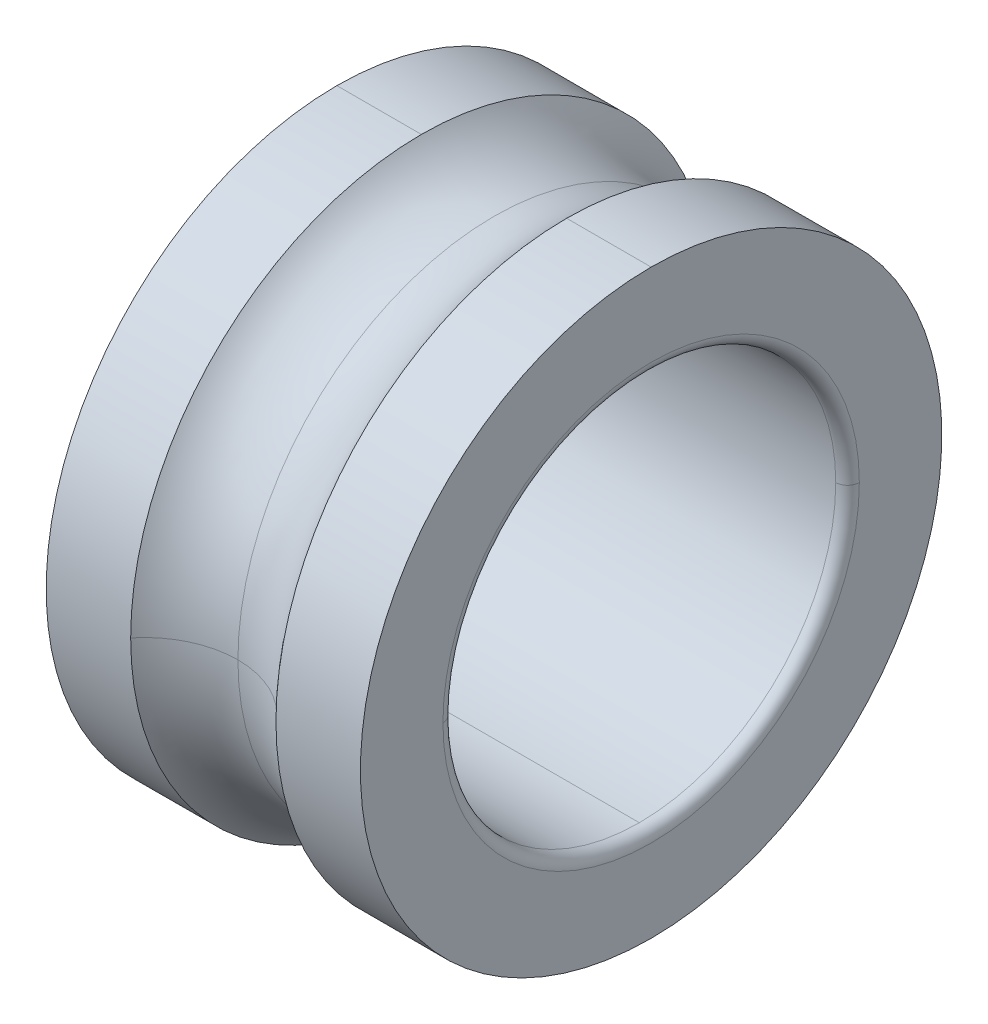
ISO-10303-21;
HEADER;
FILE_DESCRIPTION(('STEP AP214'),'2;1');
FILE_NAME('part.step','',(''),(''),'','','');
FILE_SCHEMA(('AUTOMOTIVE_DESIGN { 1 0 10303 214 1 1 1 1 }'));
ENDSEC;
DATA;
#1=APPLICATION_CONTEXT('core data for automotive mechanical design processes');
#2=APPLICATION_PROTOCOL_DEFINITION('international standard','automotive_design',2000,#1);
#3=PRODUCT_CONTEXT('',#1,'mechanical');
#4=PRODUCT('Part','Part','',(#3));
#5=PRODUCT_RELATED_PRODUCT_CATEGORY('part','',(#4));
#6=PRODUCT_DEFINITION_FORMATION('','',#4);
#7=PRODUCT_DEFINITION_CONTEXT('part definition',#1,'design');
#8=PRODUCT_DEFINITION('design','',#6,#7);
#9=PRODUCT_DEFINITION_SHAPE('','',#8);
#10=(LENGTH_UNIT() NAMED_UNIT(*) SI_UNIT(.MILLI.,.METRE.));
#11=(NAMED_UNIT(*) PLANE_ANGLE_UNIT() SI_UNIT($,.RADIAN.));
#12=(NAMED_UNIT(*) SI_UNIT($,.STERADIAN.) SOLID_ANGLE_UNIT());
#13=UNCERTAINTY_MEASURE_WITH_UNIT(LENGTH_MEASURE(1.E-05),#10,'distance_accuracy_value','');
#14=(GEOMETRIC_REPRESENTATION_CONTEXT(3) GLOBAL_UNCERTAINTY_ASSIGNED_CONTEXT((#13)) GLOBAL_UNIT_ASSIGNED_CONTEXT((#10,
#11,#12)) REPRESENTATION_CONTEXT('',''));
#15=CARTESIAN_POINT('',(0.,0.,0.));
#16=DIRECTION('',(0.,0.,1.));
#17=DIRECTION('',(1.,0.,0.));
#18=AXIS2_PLACEMENT_3D('',#15,#16,#17);
#19=CARTESIAN_POINT('',(6.92454867367814,0.,0.));
#20=DIRECTION('',(1.,0.,0.));
#21=DIRECTION('',(0.,1.,0.));
#22=AXIS2_PLACEMENT_3D('',#19,#20,#21);
#23=CYLINDRICAL_SURFACE('',#22,7.4);
#24=DIRECTION('',(1.,0.,0.));
#25=VECTOR('',#24,1.);
#26=CARTESIAN_POINT('',(6.92454867367814,7.4,0.));
#27=LINE('',#26,#25);
#28=CARTESIAN_POINT('',(5.84909734735627,7.4,0.));
#29=VERTEX_POINT('',#28);
#30=CARTESIAN_POINT('',(8.,7.4,0.));
#31=VERTEX_POINT('',#30);
#32=EDGE_CURVE('E138',#29,#31,#27,.T.);
#33=ORIENTED_EDGE('',*,*,#32,.T.);
#34=CARTESIAN_POINT('',(8.,0.,0.));
#35=DIRECTION('',(1.,0.,0.));
#36=DIRECTION('',(0.,1.,0.));
#37=AXIS2_PLACEMENT_3D('',#34,#35,#36);
#38=CIRCLE('',#37,7.4);
#39=CARTESIAN_POINT('',(8.,-7.4,0.));
#40=VERTEX_POINT('',#39);
#41=EDGE_CURVE('E185',#40,#31,#38,.T.);
#42=ORIENTED_EDGE('',*,*,#41,.F.);
#43=DIRECTION('',(-1.,0.,0.));
#44=VECTOR('',#43,1.);
#45=CARTESIAN_POINT('',(6.92454867367814,-7.4,0.));
#46=LINE('',#45,#44);
#47=CARTESIAN_POINT('',(5.84909734735627,-7.4,0.));
#48=VERTEX_POINT('',#47);
#49=EDGE_CURVE('E141',#40,#48,#46,.T.);
#50=ORIENTED_EDGE('',*,*,#49,.T.);
#51=CARTESIAN_POINT('',(5.84909734735627,0.,0.));
#52=DIRECTION('',(1.,0.,0.));
#53=DIRECTION('',(0.,1.,0.));
#54=AXIS2_PLACEMENT_3D('',#51,#52,#53);
#55=CIRCLE('',#54,7.4);
#56=CARTESIAN_POINT('',(5.84909734735627,0.,-7.4));
#57=VERTEX_POINT('',#56);
#58=EDGE_CURVE('E133',#48,#57,#55,.T.);
#59=ORIENTED_EDGE('',*,*,#58,.T.);
#60=CARTESIAN_POINT('',(5.84909734735627,0.,0.));
#61=DIRECTION('',(1.,0.,0.));
#62=DIRECTION('',(0.,1.,0.));
#63=AXIS2_PLACEMENT_3D('',#60,#61,#62);
#64=CIRCLE('',#63,7.4);
#65=EDGE_CURVE('E207',#57,#29,#64,.T.);
#66=ORIENTED_EDGE('',*,*,#65,.T.);
#67=EDGE_LOOP('',(#33,#42,#50,#59,#66));
#68=FACE_BOUND('',#67,.T.);
#69=ADVANCED_FACE('F16',(#68),#23,.T.);
#70=CARTESIAN_POINT('',(4.,0.,0.));
#71=DIRECTION('',(1.,0.,0.));
#72=DIRECTION('',(0.,0.,-1.));
#73=AXIS2_PLACEMENT_3D('',#70,#71,#72);
#74=TOROIDAL_SURFACE('',#73,8.9,2.381);
#75=CARTESIAN_POINT('',(4.,0.,0.));
#76=DIRECTION('',(-1.,0.,0.));
#77=DIRECTION('',(0.,0.,1.));
#78=AXIS2_PLACEMENT_3D('',#75,#76,#77);
#79=CIRCLE('',#78,6.519);
#80=CARTESIAN_POINT('',(4.,0.,6.519));
#81=VERTEX_POINT('',#80);
#82=CARTESIAN_POINT('',(4.,0.,-6.519));
#83=VERTEX_POINT('',#82);
#84=EDGE_CURVE('E223',#81,#83,#79,.T.);
#85=ORIENTED_EDGE('',*,*,#84,.T.);
#86=CARTESIAN_POINT('',(4.,0.,-8.9));
#87=DIRECTION('',(0.,-1.,0.));
#88=DIRECTION('',(0.,0.,-1.));
#89=AXIS2_PLACEMENT_3D('',#86,#87,#88);
#90=CIRCLE('',#89,2.381);
#91=CARTESIAN_POINT('',(2.15090265264373,0.,-7.4));
#92=VERTEX_POINT('',#91);
#93=EDGE_CURVE('E152',#83,#92,#90,.T.);
#94=ORIENTED_EDGE('',*,*,#93,.T.);
#95=CARTESIAN_POINT('',(2.15090265264373,0.,0.));
#96=DIRECTION('',(1.,0.,0.));
#97=DIRECTION('',(0.,1.,0.));
#98=AXIS2_PLACEMENT_3D('',#95,#96,#97);
#99=CIRCLE('',#98,7.4);
#100=CARTESIAN_POINT('',(2.15090265264373,7.4,0.));
#101=VERTEX_POINT('',#100);
#102=EDGE_CURVE('E11',#92,#101,#99,.T.);
#103=ORIENTED_EDGE('',*,*,#102,.T.);
#104=CARTESIAN_POINT('',(2.15090265264373,0.,0.));
#105=DIRECTION('',(1.,0.,0.));
#106=DIRECTION('',(0.,1.,0.));
#107=AXIS2_PLACEMENT_3D('',#104,#105,#106);
#108=CIRCLE('',#107,7.4);
#109=CARTESIAN_POINT('',(2.15090265264373,0.,7.4));
#110=VERTEX_POINT('',#109);
#111=EDGE_CURVE('E162',#101,#110,#108,.T.);
#112=ORIENTED_EDGE('',*,*,#111,.T.);
#113=CARTESIAN_POINT('',(4.,0.,8.9));
#114=DIRECTION('',(0.,-1.,0.));
#115=DIRECTION('',(0.,0.,1.));
#116=AXIS2_PLACEMENT_3D('',#113,#114,#115);
#117=CIRCLE('',#116,2.381);
#118=EDGE_CURVE('E146',#110,#81,#117,.T.);
#119=ORIENTED_EDGE('',*,*,#118,.T.);
#120=EDGE_LOOP('',(#85,#94,#103,#112,#119));
#121=FACE_BOUND('',#120,.T.);
#122=ADVANCED_FACE('F229',(#121),#74,.F.);
#123=CARTESIAN_POINT('',(1.07545132632186,0.,0.));
#124=DIRECTION('',(1.,0.,0.));
#125=DIRECTION('',(0.,1.,0.));
#126=AXIS2_PLACEMENT_3D('',#123,#124,#125);
#127=CYLINDRICAL_SURFACE('',#126,7.4);
#128=DIRECTION('',(1.,0.,0.));
#129=VECTOR('',#128,1.);
#130=CARTESIAN_POINT('',(1.07545132632186,7.4,0.));
#131=LINE('',#130,#129);
#132=CARTESIAN_POINT('',(0.,7.4,0.));
#133=VERTEX_POINT('',#132);
#134=EDGE_CURVE('E155',#133,#101,#131,.T.);
#135=ORIENTED_EDGE('',*,*,#134,.T.);
#136=ORIENTED_EDGE('',*,*,#102,.F.);
#137=CARTESIAN_POINT('',(2.15090265264373,0.,0.));
#138=DIRECTION('',(1.,0.,0.));
#139=DIRECTION('',(0.,1.,0.));
#140=AXIS2_PLACEMENT_3D('',#137,#138,#139);
#141=CIRCLE('',#140,7.4);
#142=CARTESIAN_POINT('',(2.15090265264373,-7.4,0.));
#143=VERTEX_POINT('',#142);
#144=EDGE_CURVE('E149',#143,#92,#141,.T.);
#145=ORIENTED_EDGE('',*,*,#144,.F.);
#146=DIRECTION('',(-1.,0.,0.));
#147=VECTOR('',#146,1.);
#148=CARTESIAN_POINT('',(1.07545132632186,-7.4,0.));
#149=LINE('',#148,#147);
#150=CARTESIAN_POINT('',(0.,-7.4,0.));
#151=VERTEX_POINT('',#150);
#152=EDGE_CURVE('E159',#143,#151,#149,.T.);
#153=ORIENTED_EDGE('',*,*,#152,.T.);
#154=CARTESIAN_POINT('',(0.,0.,0.));
#155=DIRECTION('',(1.,0.,0.));
#156=DIRECTION('',(0.,1.,0.));
#157=AXIS2_PLACEMENT_3D('',#154,#155,#156);
#158=CIRCLE('',#157,7.4);
#159=EDGE_CURVE('E24',#151,#133,#158,.T.);
#160=ORIENTED_EDGE('',*,*,#159,.T.);
#161=EDGE_LOOP('',(#135,#136,#145,#153,#160));
#162=FACE_BOUND('',#161,.T.);
#163=ADVANCED_FACE('F196',(#162),#127,.T.);
#164=CARTESIAN_POINT('',(0.,6.35,0.));
#165=DIRECTION('',(-1.,0.,0.));
#166=DIRECTION('',(0.,0.,1.));
#167=AXIS2_PLACEMENT_3D('',#164,#165,#166);
#168=PLANE('',#167);
#169=CARTESIAN_POINT('',(0.,0.,0.));
#170=DIRECTION('',(1.,0.,0.));
#171=DIRECTION('',(0.,1.,0.));
#172=AXIS2_PLACEMENT_3D('',#169,#170,#171);
#173=CIRCLE('',#172,5.3);
#174=CARTESIAN_POINT('',(0.,0.,5.3));
#175=VERTEX_POINT('',#174);
#176=CARTESIAN_POINT('',(0.,0.,-5.3));
#177=VERTEX_POINT('',#176);
#178=EDGE_CURVE('E190',#175,#177,#173,.T.);
#179=ORIENTED_EDGE('',*,*,#178,.T.);
#180=CARTESIAN_POINT('',(0.,0.,0.));
#181=DIRECTION('',(1.,0.,0.));
#182=DIRECTION('',(0.,1.,0.));
#183=AXIS2_PLACEMENT_3D('',#180,#181,#182);
#184=CIRCLE('',#183,5.3);
#185=EDGE_CURVE('E176',#177,#175,#184,.T.);
#186=ORIENTED_EDGE('',*,*,#185,.T.);
#187=EDGE_LOOP('',(#179,#186));
#188=FACE_BOUND('',#187,.T.);
#189=CARTESIAN_POINT('',(0.,0.,0.));
#190=DIRECTION('',(1.,0.,0.));
#191=DIRECTION('',(0.,1.,0.));
#192=AXIS2_PLACEMENT_3D('',#189,#190,#191);
#193=CIRCLE('',#192,7.4);
#194=EDGE_CURVE('E156',#133,#151,#193,.T.);
#195=ORIENTED_EDGE('',*,*,#194,.F.);
#196=ORIENTED_EDGE('',*,*,#159,.F.);
#197=EDGE_LOOP('',(#195,#196));
#198=FACE_BOUND('',#197,.T.);
#199=ADVANCED_FACE('F18',(#188,#198),#168,.T.);
#200=CARTESIAN_POINT('',(0.3,0.,0.));
#201=DIRECTION('',(1.,0.,0.));
#202=DIRECTION('',(0.,0.,-1.));
#203=AXIS2_PLACEMENT_3D('',#200,#201,#202);
#204=TOROIDAL_SURFACE('',#203,5.3,0.3);
#205=CARTESIAN_POINT('',(0.3,0.,-5.3));
#206=DIRECTION('',(0.,-1.,0.));
#207=DIRECTION('',(0.,0.,-1.));
#208=AXIS2_PLACEMENT_3D('',#205,#206,#207);
#209=CIRCLE('',#208,0.3);
#210=CARTESIAN_POINT('',(0.3,0.,-5.));
#211=VERTEX_POINT('',#210);
#212=EDGE_CURVE('E164',#211,#177,#209,.T.);
#213=ORIENTED_EDGE('',*,*,#212,.T.);
#214=ORIENTED_EDGE('',*,*,#178,.F.);
#215=CARTESIAN_POINT('',(0.3,0.,5.3));
#216=DIRECTION('',(0.,-1.,0.));
#217=DIRECTION('',(0.,0.,1.));
#218=AXIS2_PLACEMENT_3D('',#215,#216,#217);
#219=CIRCLE('',#218,0.3);
#220=CARTESIAN_POINT('',(0.3,0.,5.));
#221=VERTEX_POINT('',#220);
#222=EDGE_CURVE('E173',#175,#221,#219,.T.);
#223=ORIENTED_EDGE('',*,*,#222,.T.);
#224=CARTESIAN_POINT('',(0.3,0.,0.));
#225=DIRECTION('',(1.,0.,0.));
#226=DIRECTION('',(0.,1.,0.));
#227=AXIS2_PLACEMENT_3D('',#224,#225,#226);
#228=CIRCLE('',#227,5.);
#229=CARTESIAN_POINT('',(0.3,-5.,0.));
#230=VERTEX_POINT('',#229);
#231=EDGE_CURVE('E188',#221,#230,#228,.T.);
#232=ORIENTED_EDGE('',*,*,#231,.T.);
#233=CARTESIAN_POINT('',(0.3,0.,0.));
#234=DIRECTION('',(1.,0.,0.));
#235=DIRECTION('',(0.,1.,0.));
#236=AXIS2_PLACEMENT_3D('',#233,#234,#235);
#237=CIRCLE('',#236,5.);
#238=EDGE_CURVE('E124',#230,#211,#237,.T.);
#239=ORIENTED_EDGE('',*,*,#238,.T.);
#240=EDGE_LOOP('',(#213,#214,#223,#232,#239));
#241=FACE_BOUND('',#240,.T.);
#242=ADVANCED_FACE('F271',(#241),#204,.T.);
#243=CARTESIAN_POINT('',(4.,0.,0.));
#244=DIRECTION('',(1.,0.,0.));
#245=DIRECTION('',(0.,1.,0.));
#246=AXIS2_PLACEMENT_3D('',#243,#244,#245);
#247=CYLINDRICAL_SURFACE('',#246,5.);
#248=DIRECTION('',(1.,0.,0.));
#249=VECTOR('',#248,1.);
#250=CARTESIAN_POINT('',(4.,5.,0.));
#251=LINE('',#250,#249);
#252=CARTESIAN_POINT('',(0.3,5.,0.));
#253=VERTEX_POINT('',#252);
#254=CARTESIAN_POINT('',(7.7,5.,0.));
#255=VERTEX_POINT('',#254);
#256=EDGE_CURVE('E179',#253,#255,#251,.T.);
#257=ORIENTED_EDGE('',*,*,#256,.T.);
#258=CARTESIAN_POINT('',(7.7,0.,0.));
#259=DIRECTION('',(1.,0.,0.));
#260=DIRECTION('',(0.,1.,0.));
#261=AXIS2_PLACEMENT_3D('',#258,#259,#260);
#262=CIRCLE('',#261,5.);
#263=CARTESIAN_POINT('',(7.7,0.,5.));
#264=VERTEX_POINT('',#263);
#265=EDGE_CURVE('E115',#255,#264,#262,.T.);
#266=ORIENTED_EDGE('',*,*,#265,.T.);
#267=CARTESIAN_POINT('',(7.7,0.,0.));
#268=DIRECTION('',(1.,0.,0.));
#269=DIRECTION('',(0.,1.,0.));
#270=AXIS2_PLACEMENT_3D('',#267,#268,#269);
#271=CIRCLE('',#270,5.);
#272=CARTESIAN_POINT('',(7.7,-5.,0.));
#273=VERTEX_POINT('',#272);
#274=EDGE_CURVE('E31',#264,#273,#271,.T.);
#275=ORIENTED_EDGE('',*,*,#274,.T.);
#276=DIRECTION('',(-1.,0.,0.));
#277=VECTOR('',#276,1.);
#278=CARTESIAN_POINT('',(4.,-5.,0.));
#279=LINE('',#278,#277);
#280=EDGE_CURVE('E122',#273,#230,#279,.T.);
#281=ORIENTED_EDGE('',*,*,#280,.T.);
#282=ORIENTED_EDGE('',*,*,#231,.F.);
#283=CARTESIAN_POINT('',(0.3,0.,0.));
#284=DIRECTION('',(1.,0.,0.));
#285=DIRECTION('',(0.,1.,0.));
#286=AXIS2_PLACEMENT_3D('',#283,#284,#285);
#287=CIRCLE('',#286,5.);
#288=EDGE_CURVE('E170',#253,#221,#287,.T.);
#289=ORIENTED_EDGE('',*,*,#288,.F.);
#290=EDGE_LOOP('',(#257,#266,#275,#281,#282,#289));
#291=FACE_BOUND('',#290,.T.);
#292=ADVANCED_FACE('F254',(#291),#247,.F.);
#293=CARTESIAN_POINT('',(7.7,0.,0.));
#294=DIRECTION('',(1.,0.,0.));
#295=DIRECTION('',(0.,0.,-1.));
#296=AXIS2_PLACEMENT_3D('',#293,#294,#295);
#297=TOROIDAL_SURFACE('',#296,5.3,0.3);
#298=CARTESIAN_POINT('',(7.7,0.,-5.3));
#299=DIRECTION('',(0.,-1.,0.));
#300=DIRECTION('',(0.,0.,-1.));
#301=AXIS2_PLACEMENT_3D('',#298,#299,#300);
#302=CIRCLE('',#301,0.3);
#303=CARTESIAN_POINT('',(8.,0.,-5.3));
#304=VERTEX_POINT('',#303);
#305=CARTESIAN_POINT('',(7.7,0.,-5.));
#306=VERTEX_POINT('',#305);
#307=EDGE_CURVE('E101',#304,#306,#302,.T.);
#308=ORIENTED_EDGE('',*,*,#307,.T.);
#309=CARTESIAN_POINT('',(7.7,0.,0.));
#310=DIRECTION('',(1.,0.,0.));
#311=DIRECTION('',(0.,1.,0.));
#312=AXIS2_PLACEMENT_3D('',#309,#310,#311);
#313=CIRCLE('',#312,5.);
#314=EDGE_CURVE('E105',#273,#306,#313,.T.);
#315=ORIENTED_EDGE('',*,*,#314,.F.);
#316=ORIENTED_EDGE('',*,*,#274,.F.);
#317=CARTESIAN_POINT('',(7.7,0.,5.3));
#318=DIRECTION('',(0.,-1.,0.));
#319=DIRECTION('',(0.,0.,1.));
#320=AXIS2_PLACEMENT_3D('',#317,#318,#319);
#321=CIRCLE('',#320,0.3);
#322=CARTESIAN_POINT('',(8.,0.,5.3));
#323=VERTEX_POINT('',#322);
#324=EDGE_CURVE('E182',#264,#323,#321,.T.);
#325=ORIENTED_EDGE('',*,*,#324,.T.);
#326=CARTESIAN_POINT('',(8.,0.,0.));
#327=DIRECTION('',(1.,0.,0.));
#328=DIRECTION('',(0.,1.,0.));
#329=AXIS2_PLACEMENT_3D('',#326,#327,#328);
#330=CIRCLE('',#329,5.3);
#331=EDGE_CURVE('E39',#323,#304,#330,.T.);
#332=ORIENTED_EDGE('',*,*,#331,.T.);
#333=EDGE_LOOP('',(#308,#315,#316,#325,#332));
#334=FACE_BOUND('',#333,.T.);
#335=ADVANCED_FACE('F103',(#334),#297,.T.);
#336=CARTESIAN_POINT('',(8.,6.35,0.));
#337=DIRECTION('',(1.,0.,0.));
#338=DIRECTION('',(0.,1.,0.));
#339=AXIS2_PLACEMENT_3D('',#336,#337,#338);
#340=PLANE('',#339);
#341=CARTESIAN_POINT('',(8.,0.,0.));
#342=DIRECTION('',(1.,0.,0.));
#343=DIRECTION('',(0.,1.,0.));
#344=AXIS2_PLACEMENT_3D('',#341,#342,#343);
#345=CIRCLE('',#344,5.3);
#346=EDGE_CURVE('E109',#304,#323,#345,.T.);
#347=ORIENTED_EDGE('',*,*,#346,.F.);
#348=ORIENTED_EDGE('',*,*,#331,.F.);
#349=EDGE_LOOP('',(#347,#348));
#350=FACE_BOUND('',#349,.T.);
#351=CARTESIAN_POINT('',(8.,0.,0.));
#352=DIRECTION('',(1.,0.,0.));
#353=DIRECTION('',(0.,1.,0.));
#354=AXIS2_PLACEMENT_3D('',#351,#352,#353);
#355=CIRCLE('',#354,7.4);
#356=EDGE_CURVE('E143',#31,#40,#355,.T.);
#357=ORIENTED_EDGE('',*,*,#356,.T.);
#358=ORIENTED_EDGE('',*,*,#41,.T.);
#359=EDGE_LOOP('',(#357,#358));
#360=FACE_BOUND('',#359,.T.);
#361=ADVANCED_FACE('F245',(#350,#360),#340,.T.);
#362=CARTESIAN_POINT('',(7.7,0.,0.));
#363=DIRECTION('',(1.,0.,0.));
#364=DIRECTION('',(0.,0.,-1.));
#365=AXIS2_PLACEMENT_3D('',#362,#363,#364);
#366=TOROIDAL_SURFACE('',#365,5.3,0.3);
#367=ORIENTED_EDGE('',*,*,#307,.F.);
#368=ORIENTED_EDGE('',*,*,#346,.T.);
#369=ORIENTED_EDGE('',*,*,#324,.F.);
#370=ORIENTED_EDGE('',*,*,#265,.F.);
#371=CARTESIAN_POINT('',(7.7,0.,0.));
#372=DIRECTION('',(1.,0.,0.));
#373=DIRECTION('',(0.,1.,0.));
#374=AXIS2_PLACEMENT_3D('',#371,#372,#373);
#375=CIRCLE('',#374,5.);
#376=EDGE_CURVE('E110',#306,#255,#375,.T.);
#377=ORIENTED_EDGE('',*,*,#376,.F.);
#378=EDGE_LOOP('',(#367,#368,#369,#370,#377));
#379=FACE_BOUND('',#378,.T.);
#380=ADVANCED_FACE('F113',(#379),#366,.T.);
#381=CARTESIAN_POINT('',(4.,0.,0.));
#382=DIRECTION('',(1.,0.,0.));
#383=DIRECTION('',(0.,1.,0.));
#384=AXIS2_PLACEMENT_3D('',#381,#382,#383);
#385=CYLINDRICAL_SURFACE('',#384,5.);
#386=ORIENTED_EDGE('',*,*,#256,.F.);
#387=CARTESIAN_POINT('',(0.3,0.,0.));
#388=DIRECTION('',(1.,0.,0.));
#389=DIRECTION('',(0.,1.,0.));
#390=AXIS2_PLACEMENT_3D('',#387,#388,#389);
#391=CIRCLE('',#390,5.);
#392=EDGE_CURVE('E167',#211,#253,#391,.T.);
#393=ORIENTED_EDGE('',*,*,#392,.F.);
#394=ORIENTED_EDGE('',*,*,#238,.F.);
#395=ORIENTED_EDGE('',*,*,#280,.F.);
#396=ORIENTED_EDGE('',*,*,#314,.T.);
#397=ORIENTED_EDGE('',*,*,#376,.T.);
#398=EDGE_LOOP('',(#386,#393,#394,#395,#396,#397));
#399=FACE_BOUND('',#398,.T.);
#400=ADVANCED_FACE('F119',(#399),#385,.F.);
#401=CARTESIAN_POINT('',(0.3,0.,0.));
#402=DIRECTION('',(1.,0.,0.));
#403=DIRECTION('',(0.,0.,-1.));
#404=AXIS2_PLACEMENT_3D('',#401,#402,#403);
#405=TOROIDAL_SURFACE('',#404,5.3,0.3);
#406=ORIENTED_EDGE('',*,*,#212,.F.);
#407=ORIENTED_EDGE('',*,*,#392,.T.);
#408=ORIENTED_EDGE('',*,*,#288,.T.);
#409=ORIENTED_EDGE('',*,*,#222,.F.);
#410=ORIENTED_EDGE('',*,*,#185,.F.);
#411=EDGE_LOOP('',(#406,#407,#408,#409,#410));
#412=FACE_BOUND('',#411,.T.);
#413=ADVANCED_FACE('F277',(#412),#405,.T.);
#414=CARTESIAN_POINT('',(1.07545132632186,0.,0.));
#415=DIRECTION('',(1.,0.,0.));
#416=DIRECTION('',(0.,1.,0.));
#417=AXIS2_PLACEMENT_3D('',#414,#415,#416);
#418=CYLINDRICAL_SURFACE('',#417,7.4);
#419=ORIENTED_EDGE('',*,*,#134,.F.);
#420=ORIENTED_EDGE('',*,*,#194,.T.);
#421=ORIENTED_EDGE('',*,*,#152,.F.);
#422=CARTESIAN_POINT('',(2.15090265264373,0.,0.));
#423=DIRECTION('',(1.,0.,0.));
#424=DIRECTION('',(0.,1.,0.));
#425=AXIS2_PLACEMENT_3D('',#422,#423,#424);
#426=CIRCLE('',#425,7.4);
#427=EDGE_CURVE('E128',#110,#143,#426,.T.);
#428=ORIENTED_EDGE('',*,*,#427,.F.);
#429=ORIENTED_EDGE('',*,*,#111,.F.);
#430=EDGE_LOOP('',(#419,#420,#421,#428,#429));
#431=FACE_BOUND('',#430,.T.);
#432=ADVANCED_FACE('F202',(#431),#418,.T.);
#433=CARTESIAN_POINT('',(4.,0.,0.));
#434=DIRECTION('',(1.,0.,0.));
#435=DIRECTION('',(0.,0.,-1.));
#436=AXIS2_PLACEMENT_3D('',#433,#434,#435);
#437=TOROIDAL_SURFACE('',#436,8.9,2.381);
#438=CARTESIAN_POINT('',(4.,0.,0.));
#439=DIRECTION('',(-1.,0.,0.));
#440=DIRECTION('',(0.,0.,1.));
#441=AXIS2_PLACEMENT_3D('',#438,#439,#440);
#442=CIRCLE('',#441,6.519);
#443=EDGE_CURVE('E130',#83,#81,#442,.T.);
#444=ORIENTED_EDGE('',*,*,#443,.T.);
#445=ORIENTED_EDGE('',*,*,#118,.F.);
#446=ORIENTED_EDGE('',*,*,#427,.T.);
#447=ORIENTED_EDGE('',*,*,#144,.T.);
#448=ORIENTED_EDGE('',*,*,#93,.F.);
#449=EDGE_LOOP('',(#444,#445,#446,#447,#448));
#450=FACE_BOUND('',#449,.T.);
#451=ADVANCED_FACE('F267',(#450),#437,.F.);
#452=CARTESIAN_POINT('',(6.92454867367814,0.,0.));
#453=DIRECTION('',(1.,0.,0.));
#454=DIRECTION('',(0.,1.,0.));
#455=AXIS2_PLACEMENT_3D('',#452,#453,#454);
#456=CYLINDRICAL_SURFACE('',#455,7.4);
#457=ORIENTED_EDGE('',*,*,#32,.F.);
#458=CARTESIAN_POINT('',(5.84909734735627,0.,0.));
#459=DIRECTION('',(1.,0.,0.));
#460=DIRECTION('',(0.,1.,0.));
#461=AXIS2_PLACEMENT_3D('',#458,#459,#460);
#462=CIRCLE('',#461,7.4);
#463=CARTESIAN_POINT('',(5.84909734735627,0.,7.4));
#464=VERTEX_POINT('',#463);
#465=EDGE_CURVE('E216',#29,#464,#462,.T.);
#466=ORIENTED_EDGE('',*,*,#465,.T.);
#467=CARTESIAN_POINT('',(5.84909734735627,0.,0.));
#468=DIRECTION('',(1.,0.,0.));
#469=DIRECTION('',(0.,1.,0.));
#470=AXIS2_PLACEMENT_3D('',#467,#468,#469);
#471=CIRCLE('',#470,7.4);
#472=EDGE_CURVE('E135',#464,#48,#471,.T.);
#473=ORIENTED_EDGE('',*,*,#472,.T.);
#474=ORIENTED_EDGE('',*,*,#49,.F.);
#475=ORIENTED_EDGE('',*,*,#356,.F.);
#476=EDGE_LOOP('',(#457,#466,#473,#474,#475));
#477=FACE_BOUND('',#476,.T.);
#478=ADVANCED_FACE('F242',(#477),#456,.T.);
#479=CARTESIAN_POINT('',(4.,0.,0.));
#480=DIRECTION('',(1.,0.,0.));
#481=DIRECTION('',(0.,0.,-1.));
#482=AXIS2_PLACEMENT_3D('',#479,#480,#481);
#483=TOROIDAL_SURFACE('',#482,8.9,2.381);
#484=ORIENTED_EDGE('',*,*,#443,.F.);
#485=CARTESIAN_POINT('',(4.,0.,-8.9));
#486=DIRECTION('',(0.,-1.,0.));
#487=DIRECTION('',(0.,0.,-1.));
#488=AXIS2_PLACEMENT_3D('',#485,#486,#487);
#489=CIRCLE('',#488,2.381);
#490=EDGE_CURVE('E134',#57,#83,#489,.T.);
#491=ORIENTED_EDGE('',*,*,#490,.F.);
#492=ORIENTED_EDGE('',*,*,#58,.F.);
#493=ORIENTED_EDGE('',*,*,#472,.F.);
#494=CARTESIAN_POINT('',(4.,0.,8.9));
#495=DIRECTION('',(0.,-1.,0.));
#496=DIRECTION('',(0.,0.,1.));
#497=AXIS2_PLACEMENT_3D('',#494,#495,#496);
#498=CIRCLE('',#497,2.381);
#499=EDGE_CURVE('E220',#81,#464,#498,.T.);
#500=ORIENTED_EDGE('',*,*,#499,.F.);
#501=EDGE_LOOP('',(#484,#491,#492,#493,#500));
#502=FACE_BOUND('',#501,.T.);
#503=ADVANCED_FACE('F239',(#502),#483,.F.);
#504=CARTESIAN_POINT('',(4.,0.,0.));
#505=DIRECTION('',(1.,0.,0.));
#506=DIRECTION('',(0.,0.,-1.));
#507=AXIS2_PLACEMENT_3D('',#504,#505,#506);
#508=TOROIDAL_SURFACE('',#507,8.9,2.381);
#509=ORIENTED_EDGE('',*,*,#84,.F.);
#510=ORIENTED_EDGE('',*,*,#499,.T.);
#511=ORIENTED_EDGE('',*,*,#465,.F.);
#512=ORIENTED_EDGE('',*,*,#65,.F.);
#513=ORIENTED_EDGE('',*,*,#490,.T.);
#514=EDGE_LOOP('',(#509,#510,#511,#512,#513));
#515=FACE_BOUND('',#514,.T.);
#516=ADVANCED_FACE('F233',(#515),#508,.F.);
#517=CLOSED_SHELL('',(#69,#122,#163,#199,#242,#292,#335,#361,#380,#400,#413,#432,#451,#478,#503,#516));
#518=MANIFOLD_SOLID_BREP('B1',#517);
#519=ADVANCED_BREP_SHAPE_REPRESENTATION('',(#18,#518),#14);
#520=SHAPE_DEFINITION_REPRESENTATION(#9,#519);
ENDSEC;
END-ISO-10303-21;
